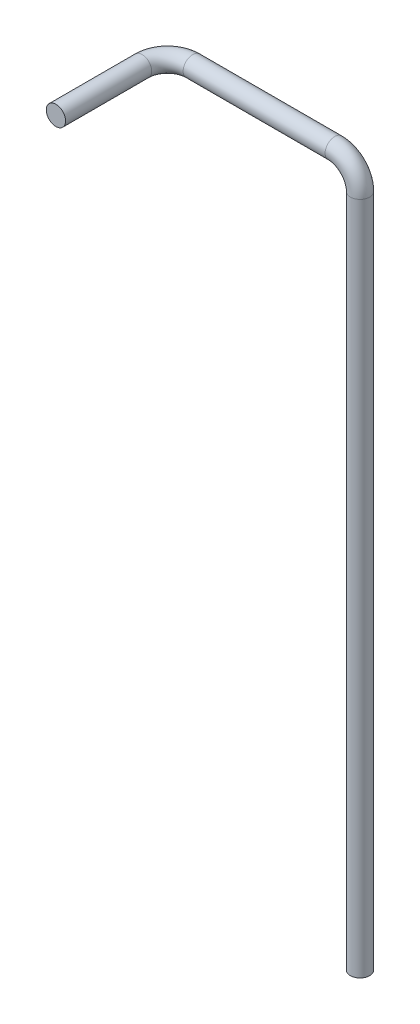
ISO-10303-21;
HEADER;
FILE_DESCRIPTION(('STEP AP214'),'2;1');
FILE_NAME('part.step','',(''),(''),'','','');
FILE_SCHEMA(('AUTOMOTIVE_DESIGN { 1 0 10303 214 1 1 1 1 }'));
ENDSEC;
DATA;
#1=APPLICATION_CONTEXT('core data for automotive mechanical design processes');
#2=APPLICATION_PROTOCOL_DEFINITION('international standard','automotive_design',2000,#1);
#3=PRODUCT_CONTEXT('',#1,'mechanical');
#4=PRODUCT('Part','Part','',(#3));
#5=PRODUCT_RELATED_PRODUCT_CATEGORY('part','',(#4));
#6=PRODUCT_DEFINITION_FORMATION('','',#4);
#7=PRODUCT_DEFINITION_CONTEXT('part definition',#1,'design');
#8=PRODUCT_DEFINITION('design','',#6,#7);
#9=PRODUCT_DEFINITION_SHAPE('','',#8);
#10=(LENGTH_UNIT() NAMED_UNIT(*) SI_UNIT(.MILLI.,.METRE.));
#11=(NAMED_UNIT(*) PLANE_ANGLE_UNIT() SI_UNIT($,.RADIAN.));
#12=(NAMED_UNIT(*) SI_UNIT($,.STERADIAN.) SOLID_ANGLE_UNIT());
#13=UNCERTAINTY_MEASURE_WITH_UNIT(LENGTH_MEASURE(1.E-05),#10,'distance_accuracy_value','');
#14=(GEOMETRIC_REPRESENTATION_CONTEXT(3) GLOBAL_UNCERTAINTY_ASSIGNED_CONTEXT((#13)) GLOBAL_UNIT_ASSIGNED_CONTEXT((#10,
#11,#12)) REPRESENTATION_CONTEXT('',''));
#15=CARTESIAN_POINT('',(0.,0.,0.));
#16=DIRECTION('',(0.,0.,1.));
#17=DIRECTION('',(1.,0.,0.));
#18=AXIS2_PLACEMENT_3D('',#15,#16,#17);
#19=CARTESIAN_POINT('',(0.,10.,0.));
#20=DIRECTION('',(0.,-1.,0.));
#21=DIRECTION('',(0.,0.,-1.));
#22=AXIS2_PLACEMENT_3D('',#19,#20,#21);
#23=CYLINDRICAL_SURFACE('',#22,9.525);
#24=CARTESIAN_POINT('',(0.,0.,0.));
#25=DIRECTION('',(0.,1.,0.));
#26=DIRECTION('',(0.,0.,1.));
#27=AXIS2_PLACEMENT_3D('',#24,#25,#26);
#28=CIRCLE('',#27,9.525);
#29=CARTESIAN_POINT('',(0.,0.,9.525));
#30=VERTEX_POINT('',#29);
#31=EDGE_CURVE('E11',#30,#30,#28,.T.);
#32=ORIENTED_EDGE('',*,*,#31,.T.);
#33=EDGE_LOOP('',(#32));
#34=FACE_BOUND('',#33,.T.);
#35=CARTESIAN_POINT('',(0.,665.,0.));
#36=DIRECTION('',(0.,1.,0.));
#37=DIRECTION('',(0.,0.,1.));
#38=AXIS2_PLACEMENT_3D('',#35,#36,#37);
#39=CIRCLE('',#38,9.525);
#40=CARTESIAN_POINT('',(9.52500000000001,665.,0.));
#41=VERTEX_POINT('',#40);
#42=EDGE_CURVE('E57',#41,#41,#39,.T.);
#43=ORIENTED_EDGE('',*,*,#42,.F.);
#44=EDGE_LOOP('',(#43));
#45=FACE_BOUND('',#44,.T.);
#46=ADVANCED_FACE('F35',(#34,#45),#23,.T.);
#47=CARTESIAN_POINT('',(0.,0.,0.));
#48=DIRECTION('',(0.,1.,0.));
#49=DIRECTION('',(0.,0.,1.));
#50=AXIS2_PLACEMENT_3D('',#47,#48,#49);
#51=PLANE('',#50);
#52=ORIENTED_EDGE('',*,*,#31,.F.);
#53=EDGE_LOOP('',(#52));
#54=FACE_BOUND('',#53,.T.);
#55=ADVANCED_FACE('F64',(#54),#51,.F.);
#56=CARTESIAN_POINT('',(-190.,690.,110.));
#57=DIRECTION('',(0.,0.,1.));
#58=DIRECTION('',(1.,0.,0.));
#59=AXIS2_PLACEMENT_3D('',#56,#57,#58);
#60=PLANE('',#59);
#61=CARTESIAN_POINT('',(-190.,690.,110.));
#62=DIRECTION('',(0.,0.,1.));
#63=DIRECTION('',(1.,0.,0.));
#64=AXIS2_PLACEMENT_3D('',#61,#62,#63);
#65=CIRCLE('',#64,9.525);
#66=CARTESIAN_POINT('',(-180.475,690.,110.));
#67=VERTEX_POINT('',#66);
#68=EDGE_CURVE('E41',#67,#67,#65,.T.);
#69=ORIENTED_EDGE('',*,*,#68,.T.);
#70=EDGE_LOOP('',(#69));
#71=FACE_BOUND('',#70,.T.);
#72=ADVANCED_FACE('F45',(#71),#60,.T.);
#73=CARTESIAN_POINT('',(-25.,665.,0.));
#74=DIRECTION('',(0.,0.,1.));
#75=DIRECTION('',(1.,0.,0.));
#76=AXIS2_PLACEMENT_3D('',#73,#74,#75);
#77=TOROIDAL_SURFACE('',#76,25.,9.525);
#78=CARTESIAN_POINT('',(-25.,690.,0.));
#79=DIRECTION('',(-1.,0.,0.));
#80=DIRECTION('',(0.,0.,1.));
#81=AXIS2_PLACEMENT_3D('',#78,#79,#80);
#82=CIRCLE('',#81,9.525);
#83=CARTESIAN_POINT('',(-25.,699.525,0.));
#84=VERTEX_POINT('',#83);
#85=EDGE_CURVE('E54',#84,#84,#82,.T.);
#86=CARTESIAN_POINT('',(-25.,665.,0.));
#87=DIRECTION('',(0.,0.,1.));
#88=DIRECTION('',(1.,0.,0.));
#89=AXIS2_PLACEMENT_3D('',#86,#87,#88);
#90=CIRCLE('',#89,34.525);
#91=EDGE_CURVE('',#41,#84,#90,.T.);
#92=ORIENTED_EDGE('',*,*,#42,.T.);
#93=ORIENTED_EDGE('',*,*,#85,.F.);
#94=ORIENTED_EDGE('',*,*,#91,.T.);
#95=ORIENTED_EDGE('',*,*,#91,.F.);
#96=EDGE_LOOP('',(#92,#94,#93,#95));
#97=FACE_BOUND('',#96,.T.);
#98=ADVANCED_FACE('F61',(#97),#77,.T.);
#99=CARTESIAN_POINT('',(-25.,690.,0.));
#100=DIRECTION('',(-1.,0.,0.));
#101=DIRECTION('',(0.,0.,1.));
#102=AXIS2_PLACEMENT_3D('',#99,#100,#101);
#103=CYLINDRICAL_SURFACE('',#102,9.525);
#104=CARTESIAN_POINT('',(-165.,690.,0.));
#105=DIRECTION('',(-1.,0.,0.));
#106=DIRECTION('',(0.,0.,1.));
#107=AXIS2_PLACEMENT_3D('',#104,#105,#106);
#108=CIRCLE('',#107,9.525);
#109=CARTESIAN_POINT('',(-165.,690.,-9.525));
#110=VERTEX_POINT('',#109);
#111=EDGE_CURVE('E49',#110,#110,#108,.T.);
#112=ORIENTED_EDGE('',*,*,#111,.F.);
#113=EDGE_LOOP('',(#112));
#114=FACE_BOUND('',#113,.T.);
#115=ORIENTED_EDGE('',*,*,#85,.T.);
#116=EDGE_LOOP('',(#115));
#117=FACE_BOUND('',#116,.T.);
#118=ADVANCED_FACE('F82',(#114,#117),#103,.T.);
#119=CARTESIAN_POINT('',(-165.,690.,25.));
#120=DIRECTION('',(0.,1.,0.));
#121=DIRECTION('',(0.,0.,1.));
#122=AXIS2_PLACEMENT_3D('',#119,#120,#121);
#123=TOROIDAL_SURFACE('',#122,25.,9.525);
#124=CARTESIAN_POINT('',(-190.,690.,25.));
#125=DIRECTION('',(0.,0.,1.));
#126=DIRECTION('',(1.,0.,0.));
#127=AXIS2_PLACEMENT_3D('',#124,#125,#126);
#128=CIRCLE('',#127,9.525);
#129=CARTESIAN_POINT('',(-199.525,690.,25.));
#130=VERTEX_POINT('',#129);
#131=EDGE_CURVE('E47',#130,#130,#128,.T.);
#132=CARTESIAN_POINT('',(-165.,690.,25.));
#133=DIRECTION('',(0.,1.,0.));
#134=DIRECTION('',(0.,0.,1.));
#135=AXIS2_PLACEMENT_3D('',#132,#133,#134);
#136=CIRCLE('',#135,34.525);
#137=EDGE_CURVE('',#110,#130,#136,.T.);
#138=ORIENTED_EDGE('',*,*,#111,.T.);
#139=ORIENTED_EDGE('',*,*,#131,.F.);
#140=ORIENTED_EDGE('',*,*,#137,.T.);
#141=ORIENTED_EDGE('',*,*,#137,.F.);
#142=EDGE_LOOP('',(#138,#140,#139,#141));
#143=FACE_BOUND('',#142,.T.);
#144=ADVANCED_FACE('F77',(#143),#123,.T.);
#145=CARTESIAN_POINT('',(-190.,690.,25.));
#146=DIRECTION('',(0.,0.,1.));
#147=DIRECTION('',(1.,0.,0.));
#148=AXIS2_PLACEMENT_3D('',#145,#146,#147);
#149=CYLINDRICAL_SURFACE('',#148,9.525);
#150=ORIENTED_EDGE('',*,*,#68,.F.);
#151=EDGE_LOOP('',(#150));
#152=FACE_BOUND('',#151,.T.);
#153=ORIENTED_EDGE('',*,*,#131,.T.);
#154=EDGE_LOOP('',(#153));
#155=FACE_BOUND('',#154,.T.);
#156=ADVANCED_FACE('F70',(#152,#155),#149,.T.);
#157=CLOSED_SHELL('',(#46,#55,#72,#98,#118,#144,#156));
#158=MANIFOLD_SOLID_BREP('B2',#157);
#159=ADVANCED_BREP_SHAPE_REPRESENTATION('',(#18,#158),#14);
#160=SHAPE_DEFINITION_REPRESENTATION(#9,#159);
ENDSEC;
END-ISO-10303-21;
